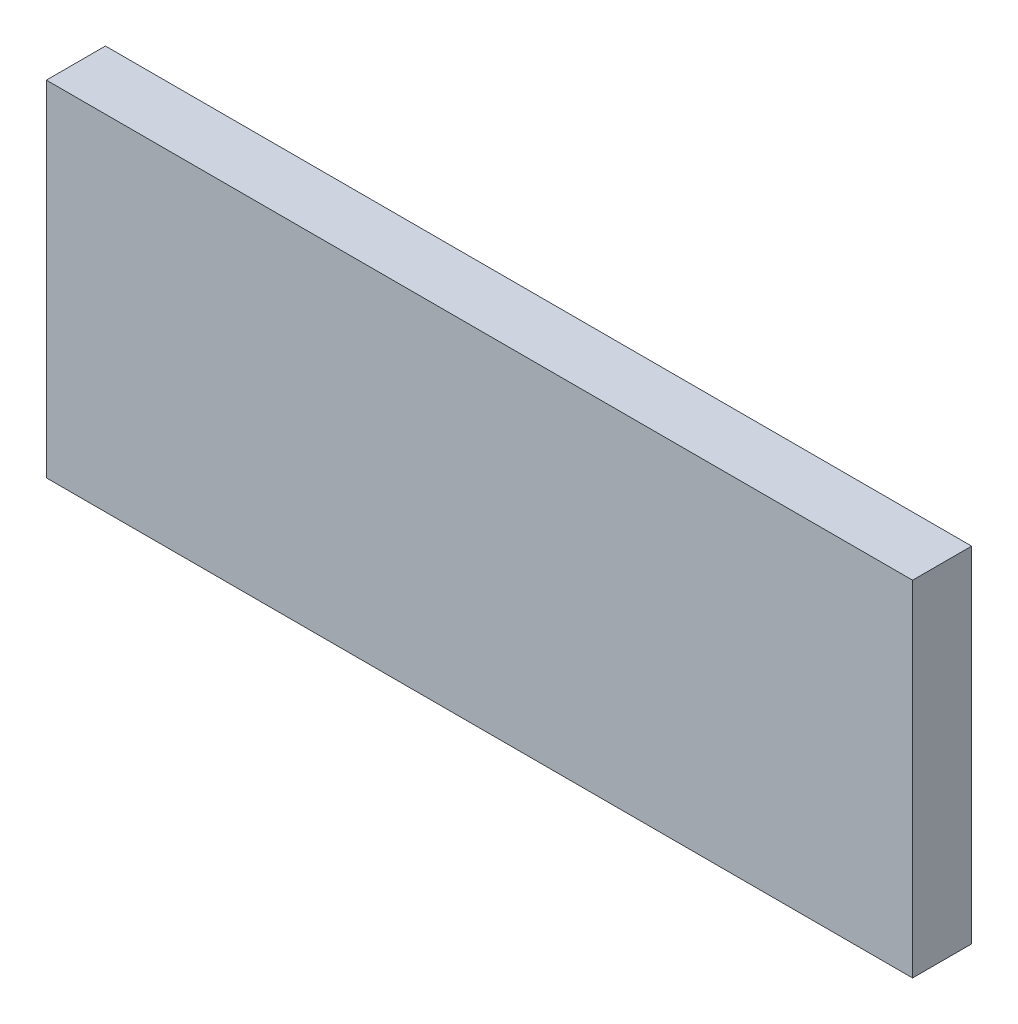
ISO-10303-21;
HEADER;
FILE_DESCRIPTION(('STEP AP214'),'2;1');
FILE_NAME('part.step','',(''),(''),'','','');
FILE_SCHEMA(('AUTOMOTIVE_DESIGN { 1 0 10303 214 1 1 1 1 }'));
ENDSEC;
DATA;
#1=APPLICATION_CONTEXT('core data for automotive mechanical design processes');
#2=APPLICATION_PROTOCOL_DEFINITION('international standard','automotive_design',2000,#1);
#3=PRODUCT_CONTEXT('',#1,'mechanical');
#4=PRODUCT('Part','Part','',(#3));
#5=PRODUCT_RELATED_PRODUCT_CATEGORY('part','',(#4));
#6=PRODUCT_DEFINITION_FORMATION('','',#4);
#7=PRODUCT_DEFINITION_CONTEXT('part definition',#1,'design');
#8=PRODUCT_DEFINITION('design','',#6,#7);
#9=PRODUCT_DEFINITION_SHAPE('','',#8);
#10=(LENGTH_UNIT() NAMED_UNIT(*) SI_UNIT(.MILLI.,.METRE.));
#11=(NAMED_UNIT(*) PLANE_ANGLE_UNIT() SI_UNIT($,.RADIAN.));
#12=(NAMED_UNIT(*) SI_UNIT($,.STERADIAN.) SOLID_ANGLE_UNIT());
#13=UNCERTAINTY_MEASURE_WITH_UNIT(LENGTH_MEASURE(1.E-05),#10,'distance_accuracy_value','');
#14=(GEOMETRIC_REPRESENTATION_CONTEXT(3) GLOBAL_UNCERTAINTY_ASSIGNED_CONTEXT((#13)) GLOBAL_UNIT_ASSIGNED_CONTEXT((#10,
#11,#12)) REPRESENTATION_CONTEXT('',''));
#15=CARTESIAN_POINT('',(0.,0.,0.));
#16=DIRECTION('',(0.,0.,1.));
#17=DIRECTION('',(1.,0.,0.));
#18=AXIS2_PLACEMENT_3D('',#15,#16,#17);
#19=CARTESIAN_POINT('',(44.,-17.5,-3.));
#20=DIRECTION('',(-1.,0.,0.));
#21=DIRECTION('',(0.,0.,-1.));
#22=AXIS2_PLACEMENT_3D('',#19,#20,#21);
#23=PLANE('',#22);
#24=DIRECTION('',(0.,1.,0.));
#25=VECTOR('',#24,1.);
#26=CARTESIAN_POINT('',(44.,-17.5,3.));
#27=LINE('',#26,#25);
#28=CARTESIAN_POINT('',(44.,-17.5,3.));
#29=VERTEX_POINT('',#28);
#30=CARTESIAN_POINT('',(44.,17.5,3.));
#31=VERTEX_POINT('',#30);
#32=EDGE_CURVE('E98',#29,#31,#27,.T.);
#33=ORIENTED_EDGE('',*,*,#32,.F.);
#34=DIRECTION('',(0.,0.,1.));
#35=VECTOR('',#34,1.);
#36=CARTESIAN_POINT('',(44.,-17.5,-3.));
#37=LINE('',#36,#35);
#38=CARTESIAN_POINT('',(44.,-17.5,-3.));
#39=VERTEX_POINT('',#38);
#40=EDGE_CURVE('E97',#39,#29,#37,.T.);
#41=ORIENTED_EDGE('',*,*,#40,.F.);
#42=DIRECTION('',(0.,1.,0.));
#43=VECTOR('',#42,1.);
#44=CARTESIAN_POINT('',(44.,-17.5,-3.));
#45=LINE('',#44,#43);
#46=CARTESIAN_POINT('',(44.,17.5,-3.));
#47=VERTEX_POINT('',#46);
#48=EDGE_CURVE('E92',#39,#47,#45,.T.);
#49=ORIENTED_EDGE('',*,*,#48,.T.);
#50=DIRECTION('',(0.,0.,1.));
#51=VECTOR('',#50,1.);
#52=CARTESIAN_POINT('',(44.,17.5,-3.));
#53=LINE('',#52,#51);
#54=EDGE_CURVE('E11',#47,#31,#53,.T.);
#55=ORIENTED_EDGE('',*,*,#54,.T.);
#56=EDGE_LOOP('',(#33,#41,#49,#55));
#57=FACE_BOUND('',#56,.T.);
#58=ADVANCED_FACE('F35',(#57),#23,.F.);
#59=CARTESIAN_POINT('',(-44.,17.5,-3.));
#60=DIRECTION('',(0.,-1.,0.));
#61=DIRECTION('',(0.,0.,1.));
#62=AXIS2_PLACEMENT_3D('',#59,#60,#61);
#63=PLANE('',#62);
#64=DIRECTION('',(-1.,0.,0.));
#65=VECTOR('',#64,1.);
#66=CARTESIAN_POINT('',(-44.,17.5,3.));
#67=LINE('',#66,#65);
#68=CARTESIAN_POINT('',(-44.,17.5,3.));
#69=VERTEX_POINT('',#68);
#70=EDGE_CURVE('E100',#31,#69,#67,.T.);
#71=ORIENTED_EDGE('',*,*,#70,.F.);
#72=ORIENTED_EDGE('',*,*,#54,.F.);
#73=DIRECTION('',(-1.,0.,0.));
#74=VECTOR('',#73,1.);
#75=CARTESIAN_POINT('',(-44.,17.5,-3.));
#76=LINE('',#75,#74);
#77=CARTESIAN_POINT('',(-44.,17.5,-3.));
#78=VERTEX_POINT('',#77);
#79=EDGE_CURVE('E76',#47,#78,#76,.T.);
#80=ORIENTED_EDGE('',*,*,#79,.T.);
#81=DIRECTION('',(0.,0.,1.));
#82=VECTOR('',#81,1.);
#83=CARTESIAN_POINT('',(-44.,17.5,-3.));
#84=LINE('',#83,#82);
#85=EDGE_CURVE('E43',#78,#69,#84,.T.);
#86=ORIENTED_EDGE('',*,*,#85,.T.);
#87=EDGE_LOOP('',(#71,#72,#80,#86));
#88=FACE_BOUND('',#87,.T.);
#89=ADVANCED_FACE('F90',(#88),#63,.F.);
#90=CARTESIAN_POINT('',(-44.,-17.5,-3.));
#91=DIRECTION('',(1.,0.,0.));
#92=DIRECTION('',(0.,0.,1.));
#93=AXIS2_PLACEMENT_3D('',#90,#91,#92);
#94=PLANE('',#93);
#95=DIRECTION('',(0.,-1.,0.));
#96=VECTOR('',#95,1.);
#97=CARTESIAN_POINT('',(-44.,-17.5,3.));
#98=LINE('',#97,#96);
#99=CARTESIAN_POINT('',(-44.,-17.5,3.));
#100=VERTEX_POINT('',#99);
#101=EDGE_CURVE('E86',#69,#100,#98,.T.);
#102=ORIENTED_EDGE('',*,*,#101,.F.);
#103=ORIENTED_EDGE('',*,*,#85,.F.);
#104=DIRECTION('',(0.,-1.,0.));
#105=VECTOR('',#104,1.);
#106=CARTESIAN_POINT('',(-44.,-17.5,-3.));
#107=LINE('',#106,#105);
#108=CARTESIAN_POINT('',(-44.,-17.5,-3.));
#109=VERTEX_POINT('',#108);
#110=EDGE_CURVE('E79',#78,#109,#107,.T.);
#111=ORIENTED_EDGE('',*,*,#110,.T.);
#112=DIRECTION('',(0.,0.,1.));
#113=VECTOR('',#112,1.);
#114=CARTESIAN_POINT('',(-44.,-17.5,-3.));
#115=LINE('',#114,#113);
#116=EDGE_CURVE('E89',#109,#100,#115,.T.);
#117=ORIENTED_EDGE('',*,*,#116,.T.);
#118=EDGE_LOOP('',(#102,#103,#111,#117));
#119=FACE_BOUND('',#118,.T.);
#120=ADVANCED_FACE('F85',(#119),#94,.F.);
#121=CARTESIAN_POINT('',(-44.,-17.5,-3.));
#122=DIRECTION('',(0.,1.,0.));
#123=DIRECTION('',(0.,0.,-1.));
#124=AXIS2_PLACEMENT_3D('',#121,#122,#123);
#125=PLANE('',#124);
#126=DIRECTION('',(1.,0.,0.));
#127=VECTOR('',#126,1.);
#128=CARTESIAN_POINT('',(-44.,-17.5,3.));
#129=LINE('',#128,#127);
#130=EDGE_CURVE('E65',#100,#29,#129,.T.);
#131=ORIENTED_EDGE('',*,*,#130,.F.);
#132=ORIENTED_EDGE('',*,*,#116,.F.);
#133=DIRECTION('',(1.,0.,0.));
#134=VECTOR('',#133,1.);
#135=CARTESIAN_POINT('',(-44.,-17.5,-3.));
#136=LINE('',#135,#134);
#137=EDGE_CURVE('E51',#109,#39,#136,.T.);
#138=ORIENTED_EDGE('',*,*,#137,.T.);
#139=ORIENTED_EDGE('',*,*,#40,.T.);
#140=EDGE_LOOP('',(#131,#132,#138,#139));
#141=FACE_BOUND('',#140,.T.);
#142=ADVANCED_FACE('F109',(#141),#125,.F.);
#143=CARTESIAN_POINT('',(0.,0.,-3.));
#144=DIRECTION('',(0.,0.,1.));
#145=DIRECTION('',(-1.,0.,0.));
#146=AXIS2_PLACEMENT_3D('',#143,#144,#145);
#147=PLANE('',#146);
#148=ORIENTED_EDGE('',*,*,#48,.F.);
#149=ORIENTED_EDGE('',*,*,#137,.F.);
#150=ORIENTED_EDGE('',*,*,#110,.F.);
#151=ORIENTED_EDGE('',*,*,#79,.F.);
#152=EDGE_LOOP('',(#148,#149,#150,#151));
#153=FACE_BOUND('',#152,.T.);
#154=ADVANCED_FACE('F81',(#153),#147,.F.);
#155=CARTESIAN_POINT('',(0.,0.,3.));
#156=DIRECTION('',(0.,0.,1.));
#157=DIRECTION('',(-1.,0.,0.));
#158=AXIS2_PLACEMENT_3D('',#155,#156,#157);
#159=PLANE('',#158);
#160=ORIENTED_EDGE('',*,*,#32,.T.);
#161=ORIENTED_EDGE('',*,*,#70,.T.);
#162=ORIENTED_EDGE('',*,*,#101,.T.);
#163=ORIENTED_EDGE('',*,*,#130,.T.);
#164=EDGE_LOOP('',(#160,#161,#162,#163));
#165=FACE_BOUND('',#164,.T.);
#166=ADVANCED_FACE('F105',(#165),#159,.T.);
#167=CLOSED_SHELL('',(#58,#89,#120,#142,#154,#166));
#168=MANIFOLD_SOLID_BREP('B2',#167);
#169=ADVANCED_BREP_SHAPE_REPRESENTATION('',(#18,#168),#14);
#170=SHAPE_DEFINITION_REPRESENTATION(#9,#169);
ENDSEC;
END-ISO-10303-21;
